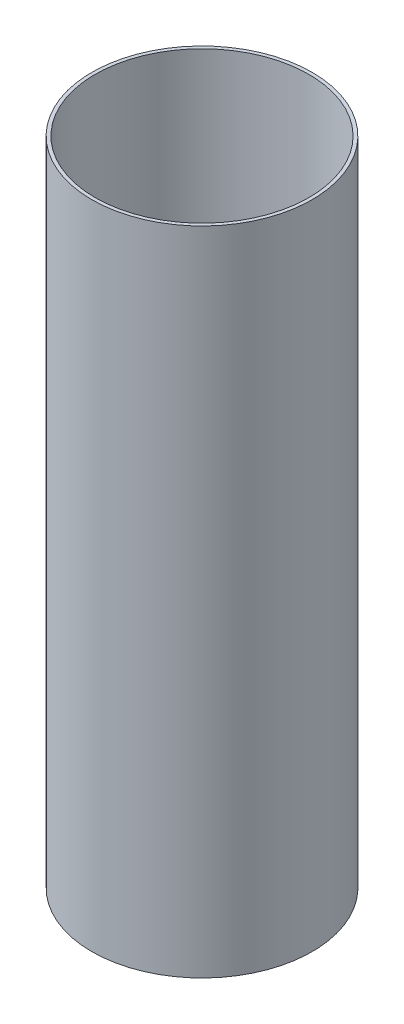
ISO-10303-21;
HEADER;
FILE_DESCRIPTION(('STEP AP214'),'2;1');
FILE_NAME('part.step','',(''),(''),'','','');
FILE_SCHEMA(('AUTOMOTIVE_DESIGN { 1 0 10303 214 1 1 1 1 }'));
ENDSEC;
DATA;
#1=APPLICATION_CONTEXT('core data for automotive mechanical design processes');
#2=APPLICATION_PROTOCOL_DEFINITION('international standard','automotive_design',2000,#1);
#3=PRODUCT_CONTEXT('',#1,'mechanical');
#4=PRODUCT('Part','Part','',(#3));
#5=PRODUCT_RELATED_PRODUCT_CATEGORY('part','',(#4));
#6=PRODUCT_DEFINITION_FORMATION('','',#4);
#7=PRODUCT_DEFINITION_CONTEXT('part definition',#1,'design');
#8=PRODUCT_DEFINITION('design','',#6,#7);
#9=PRODUCT_DEFINITION_SHAPE('','',#8);
#10=(LENGTH_UNIT() NAMED_UNIT(*) SI_UNIT(.MILLI.,.METRE.));
#11=(NAMED_UNIT(*) PLANE_ANGLE_UNIT() SI_UNIT($,.RADIAN.));
#12=(NAMED_UNIT(*) SI_UNIT($,.STERADIAN.) SOLID_ANGLE_UNIT());
#13=UNCERTAINTY_MEASURE_WITH_UNIT(LENGTH_MEASURE(1.E-05),#10,'distance_accuracy_value','');
#14=(GEOMETRIC_REPRESENTATION_CONTEXT(3) GLOBAL_UNCERTAINTY_ASSIGNED_CONTEXT((#13)) GLOBAL_UNIT_ASSIGNED_CONTEXT((#10,
#11,#12)) REPRESENTATION_CONTEXT('',''));
#15=CARTESIAN_POINT('',(0.,0.,0.));
#16=DIRECTION('',(0.,0.,1.));
#17=DIRECTION('',(1.,0.,0.));
#18=AXIS2_PLACEMENT_3D('',#15,#16,#17);
#19=CARTESIAN_POINT('',(63.0000000000002,192.,0.));
#20=DIRECTION('',(0.,1.,0.));
#21=DIRECTION('',(0.,0.,1.));
#22=AXIS2_PLACEMENT_3D('',#19,#20,#21);
#23=PLANE('',#22);
#24=CARTESIAN_POINT('',(-2.22044604925031E-13,192.,0.));
#25=DIRECTION('',(0.,1.,0.));
#26=DIRECTION('',(0.,0.,1.));
#27=AXIS2_PLACEMENT_3D('',#24,#25,#26);
#28=CIRCLE('',#27,65.0000000000004);
#29=CARTESIAN_POINT('',(-2.22044604925031E-13,192.,65.0000000000004));
#30=VERTEX_POINT('',#29);
#31=EDGE_CURVE('E10',#30,#30,#28,.T.);
#32=ORIENTED_EDGE('',*,*,#31,.T.);
#33=EDGE_LOOP('',(#32));
#34=FACE_BOUND('',#33,.T.);
#35=CARTESIAN_POINT('',(-2.22044604925031E-13,192.,0.));
#36=DIRECTION('',(0.,1.,0.));
#37=DIRECTION('',(0.,0.,1.));
#38=AXIS2_PLACEMENT_3D('',#35,#36,#37);
#39=CIRCLE('',#38,63.0000000000004);
#40=CARTESIAN_POINT('',(-2.22044604925031E-13,192.,63.0000000000004));
#41=VERTEX_POINT('',#40);
#42=EDGE_CURVE('E55',#41,#41,#39,.T.);
#43=ORIENTED_EDGE('',*,*,#42,.F.);
#44=EDGE_LOOP('',(#43));
#45=FACE_BOUND('',#44,.T.);
#46=ADVANCED_FACE('F41',(#34,#45),#23,.T.);
#47=CARTESIAN_POINT('',(-2.22044604925031E-13,150.,0.));
#48=DIRECTION('',(0.,1.,0.));
#49=DIRECTION('',(0.,0.,1.));
#50=AXIS2_PLACEMENT_3D('',#47,#48,#49);
#51=CYLINDRICAL_SURFACE('',#50,65.0000000000004);
#52=CARTESIAN_POINT('',(-2.22044604925031E-13,-192.,0.));
#53=DIRECTION('',(0.,1.,0.));
#54=DIRECTION('',(0.,0.,1.));
#55=AXIS2_PLACEMENT_3D('',#52,#53,#54);
#56=CIRCLE('',#55,65.0000000000004);
#57=CARTESIAN_POINT('',(-2.22044604925031E-13,-192.,65.0000000000004));
#58=VERTEX_POINT('',#57);
#59=EDGE_CURVE('E47',#58,#58,#56,.T.);
#60=ORIENTED_EDGE('',*,*,#59,.T.);
#61=EDGE_LOOP('',(#60));
#62=FACE_BOUND('',#61,.T.);
#63=ORIENTED_EDGE('',*,*,#31,.F.);
#64=EDGE_LOOP('',(#63));
#65=FACE_BOUND('',#64,.T.);
#66=ADVANCED_FACE('F64',(#62,#65),#51,.T.);
#67=CARTESIAN_POINT('',(63.0000000000002,-192.,0.));
#68=DIRECTION('',(0.,1.,0.));
#69=DIRECTION('',(0.,0.,1.));
#70=AXIS2_PLACEMENT_3D('',#67,#68,#69);
#71=PLANE('',#70);
#72=ORIENTED_EDGE('',*,*,#59,.F.);
#73=EDGE_LOOP('',(#72));
#74=FACE_BOUND('',#73,.T.);
#75=CARTESIAN_POINT('',(-2.22044604925031E-13,-192.,0.));
#76=DIRECTION('',(0.,1.,0.));
#77=DIRECTION('',(0.,0.,1.));
#78=AXIS2_PLACEMENT_3D('',#75,#76,#77);
#79=CIRCLE('',#78,63.0000000000004);
#80=CARTESIAN_POINT('',(-2.22044604925031E-13,-192.,63.0000000000004));
#81=VERTEX_POINT('',#80);
#82=EDGE_CURVE('E51',#81,#81,#79,.T.);
#83=ORIENTED_EDGE('',*,*,#82,.T.);
#84=EDGE_LOOP('',(#83));
#85=FACE_BOUND('',#84,.T.);
#86=ADVANCED_FACE('F68',(#74,#85),#71,.F.);
#87=CARTESIAN_POINT('',(-2.22044604925031E-13,150.,0.));
#88=DIRECTION('',(0.,1.,0.));
#89=DIRECTION('',(0.,0.,1.));
#90=AXIS2_PLACEMENT_3D('',#87,#88,#89);
#91=CYLINDRICAL_SURFACE('',#90,63.0000000000004);
#92=ORIENTED_EDGE('',*,*,#82,.F.);
#93=EDGE_LOOP('',(#92));
#94=FACE_BOUND('',#93,.T.);
#95=ORIENTED_EDGE('',*,*,#42,.T.);
#96=EDGE_LOOP('',(#95));
#97=FACE_BOUND('',#96,.T.);
#98=ADVANCED_FACE('F61',(#94,#97),#91,.F.);
#99=CLOSED_SHELL('',(#46,#66,#86,#98));
#100=MANIFOLD_SOLID_BREP('B2',#99);
#101=ADVANCED_BREP_SHAPE_REPRESENTATION('',(#18,#100),#14);
#102=SHAPE_DEFINITION_REPRESENTATION(#9,#101);
ENDSEC;
END-ISO-10303-21;
